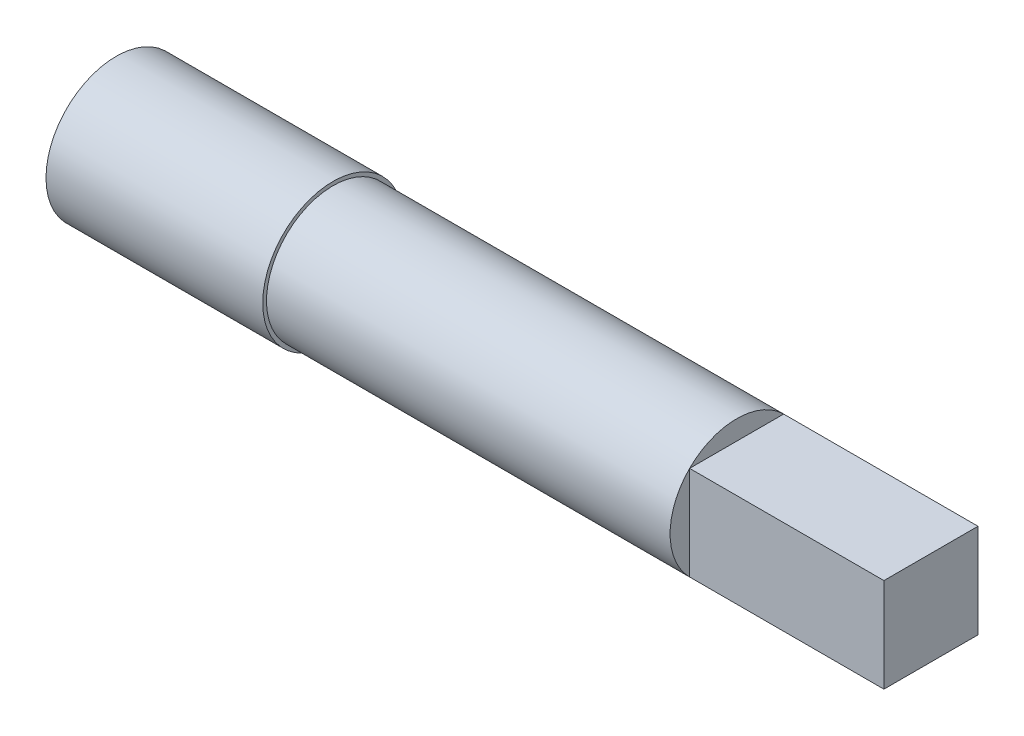
ISO-10303-21;
HEADER;
FILE_DESCRIPTION(('STEP AP214'),'2;1');
FILE_NAME('part.step','',(''),(''),'','','');
FILE_SCHEMA(('AUTOMOTIVE_DESIGN { 1 0 10303 214 1 1 1 1 }'));
ENDSEC;
DATA;
#1=APPLICATION_CONTEXT('core data for automotive mechanical design processes');
#2=APPLICATION_PROTOCOL_DEFINITION('international standard','automotive_design',2000,#1);
#3=PRODUCT_CONTEXT('',#1,'mechanical');
#4=PRODUCT('Part','Part','',(#3));
#5=PRODUCT_RELATED_PRODUCT_CATEGORY('part','',(#4));
#6=PRODUCT_DEFINITION_FORMATION('','',#4);
#7=PRODUCT_DEFINITION_CONTEXT('part definition',#1,'design');
#8=PRODUCT_DEFINITION('design','',#6,#7);
#9=PRODUCT_DEFINITION_SHAPE('','',#8);
#10=(LENGTH_UNIT() NAMED_UNIT(*) SI_UNIT(.MILLI.,.METRE.));
#11=(NAMED_UNIT(*) PLANE_ANGLE_UNIT() SI_UNIT($,.RADIAN.));
#12=(NAMED_UNIT(*) SI_UNIT($,.STERADIAN.) SOLID_ANGLE_UNIT());
#13=UNCERTAINTY_MEASURE_WITH_UNIT(LENGTH_MEASURE(1.E-05),#10,'distance_accuracy_value','');
#14=(GEOMETRIC_REPRESENTATION_CONTEXT(3) GLOBAL_UNCERTAINTY_ASSIGNED_CONTEXT((#13)) GLOBAL_UNIT_ASSIGNED_CONTEXT((#10,
#11,#12)) REPRESENTATION_CONTEXT('',''));
#15=CARTESIAN_POINT('',(0.,0.,0.));
#16=DIRECTION('',(0.,0.,1.));
#17=DIRECTION('',(1.,0.,0.));
#18=AXIS2_PLACEMENT_3D('',#15,#16,#17);
#19=CARTESIAN_POINT('',(27.25,0.,0.));
#20=DIRECTION('',(-1.,0.,0.));
#21=DIRECTION('',(0.,0.,1.));
#22=AXIS2_PLACEMENT_3D('',#19,#20,#21);
#23=CYLINDRICAL_SURFACE('',#22,2.225);
#24=CARTESIAN_POINT('',(7.25,0.,0.));
#25=DIRECTION('',(1.,0.,0.));
#26=DIRECTION('',(0.,0.,-1.));
#27=AXIS2_PLACEMENT_3D('',#24,#25,#26);
#28=CIRCLE('',#27,2.225);
#29=CARTESIAN_POINT('',(7.25,0.,-2.225));
#30=VERTEX_POINT('',#29);
#31=EDGE_CURVE('E12',#30,#30,#28,.T.);
#32=ORIENTED_EDGE('',*,*,#31,.T.);
#33=EDGE_LOOP('',(#32));
#34=FACE_BOUND('',#33,.T.);
#35=CARTESIAN_POINT('',(20.75,0.,0.));
#36=DIRECTION('',(1.,0.,0.));
#37=DIRECTION('',(0.,0.,-1.));
#38=AXIS2_PLACEMENT_3D('',#35,#36,#37);
#39=CIRCLE('',#38,2.225);
#40=CARTESIAN_POINT('',(20.75,-1.57331258814007,1.57331258814007));
#41=VERTEX_POINT('',#40);
#42=CARTESIAN_POINT('',(20.75,-1.57331258814007,-1.57331258814007));
#43=VERTEX_POINT('',#42);
#44=EDGE_CURVE('E92',#41,#43,#39,.T.);
#45=ORIENTED_EDGE('',*,*,#44,.F.);
#46=CARTESIAN_POINT('',(20.75,0.,0.));
#47=DIRECTION('',(1.,0.,0.));
#48=DIRECTION('',(0.,0.,-1.));
#49=AXIS2_PLACEMENT_3D('',#46,#47,#48);
#50=CIRCLE('',#49,2.225);
#51=CARTESIAN_POINT('',(20.75,1.57331258814007,1.57331258814007));
#52=VERTEX_POINT('',#51);
#53=EDGE_CURVE('E130',#52,#41,#50,.T.);
#54=ORIENTED_EDGE('',*,*,#53,.F.);
#55=CARTESIAN_POINT('',(20.75,0.,0.));
#56=DIRECTION('',(1.,0.,0.));
#57=DIRECTION('',(0.,0.,-1.));
#58=AXIS2_PLACEMENT_3D('',#55,#56,#57);
#59=CIRCLE('',#58,2.225);
#60=CARTESIAN_POINT('',(20.75,1.57331258814007,-1.57331258814007));
#61=VERTEX_POINT('',#60);
#62=EDGE_CURVE('E72',#61,#52,#59,.T.);
#63=ORIENTED_EDGE('',*,*,#62,.F.);
#64=CARTESIAN_POINT('',(20.75,0.,0.));
#65=DIRECTION('',(1.,0.,0.));
#66=DIRECTION('',(0.,0.,-1.));
#67=AXIS2_PLACEMENT_3D('',#64,#65,#66);
#68=CIRCLE('',#67,2.225);
#69=EDGE_CURVE('E122',#43,#61,#68,.T.);
#70=ORIENTED_EDGE('',*,*,#69,.F.);
#71=EDGE_LOOP('',(#45,#54,#63,#70));
#72=FACE_BOUND('',#71,.T.);
#73=ADVANCED_FACE('F47',(#34,#72),#23,.T.);
#74=CARTESIAN_POINT('',(27.25,0.,0.));
#75=DIRECTION('',(1.,0.,0.));
#76=DIRECTION('',(0.,0.,-1.));
#77=AXIS2_PLACEMENT_3D('',#74,#75,#76);
#78=PLANE('',#77);
#79=DIRECTION('',(0.,0.,1.));
#80=VECTOR('',#79,1.);
#81=CARTESIAN_POINT('',(27.25,-1.57331258814007,0.));
#82=LINE('',#81,#80);
#83=CARTESIAN_POINT('',(27.25,-1.57331258814007,-1.57331258814007));
#84=VERTEX_POINT('',#83);
#85=CARTESIAN_POINT('',(27.25,-1.57331258814007,1.57331258814007));
#86=VERTEX_POINT('',#85);
#87=EDGE_CURVE('E65',#84,#86,#82,.T.);
#88=ORIENTED_EDGE('',*,*,#87,.F.);
#89=DIRECTION('',(0.,1.,0.));
#90=VECTOR('',#89,1.);
#91=CARTESIAN_POINT('',(27.25,0.,-1.57331258814007));
#92=LINE('',#91,#90);
#93=CARTESIAN_POINT('',(27.25,1.57331258814007,-1.57331258814007));
#94=VERTEX_POINT('',#93);
#95=EDGE_CURVE('E117',#84,#94,#92,.T.);
#96=ORIENTED_EDGE('',*,*,#95,.T.);
#97=DIRECTION('',(0.,0.,1.));
#98=VECTOR('',#97,1.);
#99=CARTESIAN_POINT('',(27.25,1.57331258814007,0.));
#100=LINE('',#99,#98);
#101=CARTESIAN_POINT('',(27.25,1.57331258814007,1.57331258814007));
#102=VERTEX_POINT('',#101);
#103=EDGE_CURVE('E160',#94,#102,#100,.T.);
#104=ORIENTED_EDGE('',*,*,#103,.T.);
#105=DIRECTION('',(0.,1.,0.));
#106=VECTOR('',#105,1.);
#107=CARTESIAN_POINT('',(27.25,0.,1.57331258814007));
#108=LINE('',#107,#106);
#109=EDGE_CURVE('E126',#86,#102,#108,.T.);
#110=ORIENTED_EDGE('',*,*,#109,.F.);
#111=EDGE_LOOP('',(#88,#96,#104,#110));
#112=FACE_BOUND('',#111,.T.);
#113=ADVANCED_FACE('F186',(#112),#78,.T.);
#114=CARTESIAN_POINT('',(7.25,0.,0.));
#115=DIRECTION('',(-1.,0.,0.));
#116=DIRECTION('',(0.,0.,1.));
#117=AXIS2_PLACEMENT_3D('',#114,#115,#116);
#118=CYLINDRICAL_SURFACE('',#117,2.35);
#119=CARTESIAN_POINT('',(7.25,0.,0.));
#120=DIRECTION('',(1.,0.,0.));
#121=DIRECTION('',(0.,0.,-1.));
#122=AXIS2_PLACEMENT_3D('',#119,#120,#121);
#123=CIRCLE('',#122,2.35);
#124=CARTESIAN_POINT('',(7.25,0.,2.35));
#125=VERTEX_POINT('',#124);
#126=EDGE_CURVE('E57',#125,#125,#123,.T.);
#127=CARTESIAN_POINT('',(0.,0.,0.));
#128=DIRECTION('',(1.,0.,0.));
#129=DIRECTION('',(0.,0.,-1.));
#130=AXIS2_PLACEMENT_3D('',#127,#128,#129);
#131=CIRCLE('',#130,2.35);
#132=CARTESIAN_POINT('',(0.,0.,2.35));
#133=VERTEX_POINT('',#132);
#134=EDGE_CURVE('E51',#133,#133,#131,.T.);
#135=CARTESIAN_POINT('',(7.25,0.,2.35));
#136=CARTESIAN_POINT('',(7.17447916666667,0.,2.35));
#137=CARTESIAN_POINT('',(7.09895833333333,0.,2.35));
#138=CARTESIAN_POINT('',(6.94791666666667,0.,2.35));
#139=CARTESIAN_POINT('',(6.87239583333333,0.,2.35));
#140=CARTESIAN_POINT('',(6.72135416666667,0.,2.35));
#141=CARTESIAN_POINT('',(6.64583333333333,0.,2.35));
#142=CARTESIAN_POINT('',(6.49479166666667,0.,2.35));
#143=CARTESIAN_POINT('',(6.41927083333333,0.,2.35));
#144=CARTESIAN_POINT('',(6.26822916666667,0.,2.35));
#145=CARTESIAN_POINT('',(6.19270833333333,0.,2.35));
#146=CARTESIAN_POINT('',(6.04166666666667,0.,2.35));
#147=CARTESIAN_POINT('',(5.96614583333333,0.,2.35));
#148=CARTESIAN_POINT('',(5.81510416666667,0.,2.35));
#149=CARTESIAN_POINT('',(5.73958333333333,0.,2.35));
#150=CARTESIAN_POINT('',(5.58854166666667,0.,2.35));
#151=CARTESIAN_POINT('',(5.51302083333333,0.,2.35));
#152=CARTESIAN_POINT('',(5.36197916666667,0.,2.35));
#153=CARTESIAN_POINT('',(5.28645833333333,0.,2.35));
#154=CARTESIAN_POINT('',(5.13541666666667,0.,2.35));
#155=CARTESIAN_POINT('',(5.05989583333333,0.,2.35));
#156=CARTESIAN_POINT('',(4.90885416666667,0.,2.35));
#157=CARTESIAN_POINT('',(4.83333333333333,0.,2.35));
#158=CARTESIAN_POINT('',(4.68229166666667,0.,2.35));
#159=CARTESIAN_POINT('',(4.60677083333333,0.,2.35));
#160=CARTESIAN_POINT('',(4.45572916666667,0.,2.35));
#161=CARTESIAN_POINT('',(4.38020833333333,0.,2.35));
#162=CARTESIAN_POINT('',(4.22916666666667,0.,2.35));
#163=CARTESIAN_POINT('',(4.15364583333333,0.,2.35));
#164=CARTESIAN_POINT('',(4.00260416666667,0.,2.35));
#165=CARTESIAN_POINT('',(3.92708333333333,0.,2.35));
#166=CARTESIAN_POINT('',(3.77604166666667,0.,2.35));
#167=CARTESIAN_POINT('',(3.70052083333333,0.,2.35));
#168=CARTESIAN_POINT('',(3.54947916666667,0.,2.35));
#169=CARTESIAN_POINT('',(3.47395833333333,0.,2.35));
#170=CARTESIAN_POINT('',(3.32291666666667,0.,2.35));
#171=CARTESIAN_POINT('',(3.24739583333333,0.,2.35));
#172=CARTESIAN_POINT('',(3.09635416666667,0.,2.35));
#173=CARTESIAN_POINT('',(3.02083333333333,0.,2.35));
#174=CARTESIAN_POINT('',(2.86979166666667,0.,2.35));
#175=CARTESIAN_POINT('',(2.79427083333333,0.,2.35));
#176=CARTESIAN_POINT('',(2.64322916666667,0.,2.35));
#177=CARTESIAN_POINT('',(2.56770833333333,0.,2.35));
#178=CARTESIAN_POINT('',(2.41666666666667,0.,2.35));
#179=CARTESIAN_POINT('',(2.34114583333333,0.,2.35));
#180=CARTESIAN_POINT('',(2.19010416666667,0.,2.35));
#181=CARTESIAN_POINT('',(2.11458333333333,0.,2.35));
#182=CARTESIAN_POINT('',(1.96354166666667,0.,2.35));
#183=CARTESIAN_POINT('',(1.88802083333333,0.,2.35));
#184=CARTESIAN_POINT('',(1.73697916666667,0.,2.35));
#185=CARTESIAN_POINT('',(1.66145833333333,0.,2.35));
#186=CARTESIAN_POINT('',(1.51041666666667,0.,2.35));
#187=CARTESIAN_POINT('',(1.43489583333333,0.,2.35));
#188=CARTESIAN_POINT('',(1.28385416666667,0.,2.35));
#189=CARTESIAN_POINT('',(1.20833333333333,0.,2.35));
#190=CARTESIAN_POINT('',(1.05729166666667,0.,2.35));
#191=CARTESIAN_POINT('',(0.981770833333333,0.,2.35));
#192=CARTESIAN_POINT('',(0.830729166666667,0.,2.35));
#193=CARTESIAN_POINT('',(0.755208333333333,0.,2.35));
#194=CARTESIAN_POINT('',(0.604166666666667,0.,2.35));
#195=CARTESIAN_POINT('',(0.528645833333333,0.,2.35));
#196=CARTESIAN_POINT('',(0.377604166666667,0.,2.35));
#197=CARTESIAN_POINT('',(0.302083333333334,0.,2.35));
#198=CARTESIAN_POINT('',(0.151041666666667,0.,2.35));
#199=CARTESIAN_POINT('',(0.0755208333333333,0.,2.35));
#200=CARTESIAN_POINT('',(0.,0.,2.35));
#201=B_SPLINE_CURVE_WITH_KNOTS('',3,(#135,#136,#137,#138,#139,#140,#141,#142,#143,#144,#145,
#146,#147,#148,#149,#150,#151,#152,#153,#154,#155,#156,#157,#158,#159,#160,#161,#162,#163,#164,
#165,#166,#167,#168,#169,#170,#171,#172,#173,#174,#175,#176,#177,#178,#179,#180,#181,#182,#183,
#184,#185,#186,#187,#188,#189,#190,#191,#192,#193,#194,#195,#196,#197,#198,#199,#200),
.UNSPECIFIED.,.F.,.F.,(4,2,2,2,2,2,2,2,2,2,2,2,2,2,2,2,2,2,2,2,2,2,2,2,2,2,2,2,2,2,2,2,4),(0.,
0.2265625,0.453125,0.679687500000001,0.906250000000001,1.1328125,1.359375,1.5859375,1.8125,
2.0390625,2.265625,2.4921875,2.71875,2.9453125,3.171875,3.3984375,3.625,3.8515625,4.078125,
4.3046875,4.53125,4.7578125,4.984375,5.2109375,5.4375,5.6640625,5.890625,6.1171875,6.34375,
6.5703125,6.796875,7.0234375,7.25),.UNSPECIFIED.);
#202=EDGE_CURVE('BSEAM49',#125,#133,#201,.T.);
#203=ORIENTED_EDGE('',*,*,#126,.F.);
#204=ORIENTED_EDGE('',*,*,#134,.T.);
#205=ORIENTED_EDGE('',*,*,#202,.T.);
#206=ORIENTED_EDGE('',*,*,#202,.F.);
#207=EDGE_LOOP('',(#203,#205,#204,#206));
#208=FACE_BOUND('',#207,.T.);
#209=ADVANCED_FACE('F49',(#208),#118,.T.);
#210=CARTESIAN_POINT('',(7.25,0.,0.));
#211=DIRECTION('',(1.,0.,0.));
#212=DIRECTION('',(0.,0.,-1.));
#213=AXIS2_PLACEMENT_3D('',#210,#211,#212);
#214=PLANE('',#213);
#215=ORIENTED_EDGE('',*,*,#31,.F.);
#216=EDGE_LOOP('',(#215));
#217=FACE_BOUND('',#216,.T.);
#218=ORIENTED_EDGE('',*,*,#126,.T.);
#219=EDGE_LOOP('',(#218));
#220=FACE_BOUND('',#219,.T.);
#221=ADVANCED_FACE('F197',(#217,#220),#214,.T.);
#222=CARTESIAN_POINT('',(0.,0.,0.));
#223=DIRECTION('',(1.,0.,0.));
#224=DIRECTION('',(0.,0.,-1.));
#225=AXIS2_PLACEMENT_3D('',#222,#223,#224);
#226=PLANE('',#225);
#227=ORIENTED_EDGE('',*,*,#134,.F.);
#228=EDGE_LOOP('',(#227));
#229=FACE_BOUND('',#228,.T.);
#230=ADVANCED_FACE('F198',(#229),#226,.F.);
#231=CARTESIAN_POINT('',(20.75,0.,-1.57331258814007));
#232=DIRECTION('',(0.,0.,-1.));
#233=DIRECTION('',(-1.,0.,0.));
#234=AXIS2_PLACEMENT_3D('',#231,#232,#233);
#235=PLANE('',#234);
#236=ORIENTED_EDGE('',*,*,#95,.F.);
#237=DIRECTION('',(1.,0.,0.));
#238=VECTOR('',#237,1.);
#239=CARTESIAN_POINT('',(20.75,-1.57331258814007,-1.57331258814007));
#240=LINE('',#239,#238);
#241=EDGE_CURVE('E104',#43,#84,#240,.T.);
#242=ORIENTED_EDGE('',*,*,#241,.F.);
#243=DIRECTION('',(0.,1.,0.));
#244=VECTOR('',#243,1.);
#245=CARTESIAN_POINT('',(20.75,0.,-1.57331258814007));
#246=LINE('',#245,#244);
#247=EDGE_CURVE('E114',#43,#61,#246,.T.);
#248=ORIENTED_EDGE('',*,*,#247,.T.);
#249=DIRECTION('',(1.,0.,0.));
#250=VECTOR('',#249,1.);
#251=CARTESIAN_POINT('',(20.75,1.57331258814007,-1.57331258814007));
#252=LINE('',#251,#250);
#253=EDGE_CURVE('E157',#61,#94,#252,.T.);
#254=ORIENTED_EDGE('',*,*,#253,.T.);
#255=EDGE_LOOP('',(#236,#242,#248,#254));
#256=FACE_BOUND('',#255,.T.);
#257=ADVANCED_FACE('F112',(#256),#235,.T.);
#258=CARTESIAN_POINT('',(20.75,0.,0.));
#259=DIRECTION('',(1.,0.,0.));
#260=DIRECTION('',(0.,0.,-1.));
#261=AXIS2_PLACEMENT_3D('',#258,#259,#260);
#262=PLANE('',#261);
#263=ORIENTED_EDGE('',*,*,#247,.F.);
#264=ORIENTED_EDGE('',*,*,#69,.T.);
#265=EDGE_LOOP('',(#263,#264));
#266=FACE_BOUND('',#265,.T.);
#267=ADVANCED_FACE('F121',(#266),#262,.T.);
#268=CARTESIAN_POINT('',(20.75,0.,1.57331258814007));
#269=DIRECTION('',(0.,0.,-1.));
#270=DIRECTION('',(-1.,0.,0.));
#271=AXIS2_PLACEMENT_3D('',#268,#269,#270);
#272=PLANE('',#271);
#273=ORIENTED_EDGE('',*,*,#109,.T.);
#274=DIRECTION('',(1.,0.,0.));
#275=VECTOR('',#274,1.);
#276=CARTESIAN_POINT('',(20.75,1.57331258814007,1.57331258814007));
#277=LINE('',#276,#275);
#278=EDGE_CURVE('E141',#52,#102,#277,.T.);
#279=ORIENTED_EDGE('',*,*,#278,.F.);
#280=DIRECTION('',(0.,1.,0.));
#281=VECTOR('',#280,1.);
#282=CARTESIAN_POINT('',(20.75,0.,1.57331258814007));
#283=LINE('',#282,#281);
#284=EDGE_CURVE('E150',#41,#52,#283,.T.);
#285=ORIENTED_EDGE('',*,*,#284,.F.);
#286=DIRECTION('',(1.,0.,0.));
#287=VECTOR('',#286,1.);
#288=CARTESIAN_POINT('',(20.75,-1.57331258814007,1.57331258814007));
#289=LINE('',#288,#287);
#290=EDGE_CURVE('E105',#41,#86,#289,.T.);
#291=ORIENTED_EDGE('',*,*,#290,.T.);
#292=EDGE_LOOP('',(#273,#279,#285,#291));
#293=FACE_BOUND('',#292,.T.);
#294=ADVANCED_FACE('F172',(#293),#272,.F.);
#295=CARTESIAN_POINT('',(20.75,0.,0.));
#296=DIRECTION('',(1.,0.,0.));
#297=DIRECTION('',(0.,0.,-1.));
#298=AXIS2_PLACEMENT_3D('',#295,#296,#297);
#299=PLANE('',#298);
#300=ORIENTED_EDGE('',*,*,#53,.T.);
#301=ORIENTED_EDGE('',*,*,#284,.T.);
#302=EDGE_LOOP('',(#300,#301));
#303=FACE_BOUND('',#302,.T.);
#304=ADVANCED_FACE('F175',(#303),#299,.T.);
#305=CARTESIAN_POINT('',(20.75,1.57331258814007,0.));
#306=DIRECTION('',(0.,1.,0.));
#307=DIRECTION('',(0.,0.,1.));
#308=AXIS2_PLACEMENT_3D('',#305,#306,#307);
#309=PLANE('',#308);
#310=ORIENTED_EDGE('',*,*,#103,.F.);
#311=ORIENTED_EDGE('',*,*,#253,.F.);
#312=DIRECTION('',(0.,0.,1.));
#313=VECTOR('',#312,1.);
#314=CARTESIAN_POINT('',(20.75,1.57331258814007,0.));
#315=LINE('',#314,#313);
#316=EDGE_CURVE('E163',#61,#52,#315,.T.);
#317=ORIENTED_EDGE('',*,*,#316,.T.);
#318=ORIENTED_EDGE('',*,*,#278,.T.);
#319=EDGE_LOOP('',(#310,#311,#317,#318));
#320=FACE_BOUND('',#319,.T.);
#321=ADVANCED_FACE('F169',(#320),#309,.T.);
#322=CARTESIAN_POINT('',(20.75,0.,0.));
#323=DIRECTION('',(1.,0.,0.));
#324=DIRECTION('',(0.,0.,-1.));
#325=AXIS2_PLACEMENT_3D('',#322,#323,#324);
#326=PLANE('',#325);
#327=ORIENTED_EDGE('',*,*,#316,.F.);
#328=ORIENTED_EDGE('',*,*,#62,.T.);
#329=EDGE_LOOP('',(#327,#328));
#330=FACE_BOUND('',#329,.T.);
#331=ADVANCED_FACE('F182',(#330),#326,.T.);
#332=CARTESIAN_POINT('',(20.75,-1.57331258814007,0.));
#333=DIRECTION('',(0.,1.,0.));
#334=DIRECTION('',(0.,0.,1.));
#335=AXIS2_PLACEMENT_3D('',#332,#333,#334);
#336=PLANE('',#335);
#337=ORIENTED_EDGE('',*,*,#87,.T.);
#338=ORIENTED_EDGE('',*,*,#290,.F.);
#339=DIRECTION('',(0.,0.,1.));
#340=VECTOR('',#339,1.);
#341=CARTESIAN_POINT('',(20.75,-1.57331258814007,0.));
#342=LINE('',#341,#340);
#343=EDGE_CURVE('E95',#43,#41,#342,.T.);
#344=ORIENTED_EDGE('',*,*,#343,.F.);
#345=ORIENTED_EDGE('',*,*,#241,.T.);
#346=EDGE_LOOP('',(#337,#338,#344,#345));
#347=FACE_BOUND('',#346,.T.);
#348=ADVANCED_FACE('F103',(#347),#336,.F.);
#349=CARTESIAN_POINT('',(20.75,0.,0.));
#350=DIRECTION('',(1.,0.,0.));
#351=DIRECTION('',(0.,0.,-1.));
#352=AXIS2_PLACEMENT_3D('',#349,#350,#351);
#353=PLANE('',#352);
#354=ORIENTED_EDGE('',*,*,#44,.T.);
#355=ORIENTED_EDGE('',*,*,#343,.T.);
#356=EDGE_LOOP('',(#354,#355));
#357=FACE_BOUND('',#356,.T.);
#358=ADVANCED_FACE('F94',(#357),#353,.T.);
#359=CLOSED_SHELL('',(#73,#113,#209,#221,#230,#257,#267,#294,#304,#321,#331,#348,#358));
#360=MANIFOLD_SOLID_BREP('B2',#359);
#361=ADVANCED_BREP_SHAPE_REPRESENTATION('',(#18,#360),#14);
#362=SHAPE_DEFINITION_REPRESENTATION(#9,#361);
ENDSEC;
END-ISO-10303-21;
